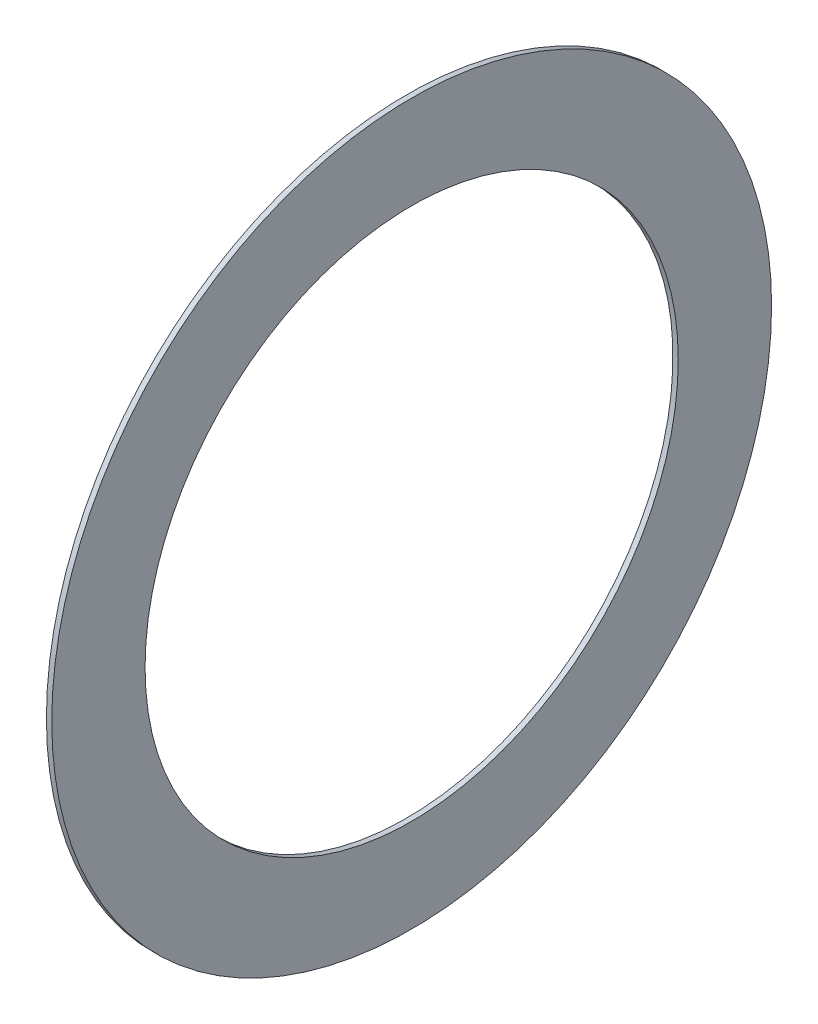
ISO-10303-21;
HEADER;
FILE_DESCRIPTION(('STEP AP214'),'2;1');
FILE_NAME('part.step','',(''),(''),'','','');
FILE_SCHEMA(('AUTOMOTIVE_DESIGN { 1 0 10303 214 1 1 1 1 }'));
ENDSEC;
DATA;
#1=APPLICATION_CONTEXT('core data for automotive mechanical design processes');
#2=APPLICATION_PROTOCOL_DEFINITION('international standard','automotive_design',2000,#1);
#3=PRODUCT_CONTEXT('',#1,'mechanical');
#4=PRODUCT('Part','Part','',(#3));
#5=PRODUCT_RELATED_PRODUCT_CATEGORY('part','',(#4));
#6=PRODUCT_DEFINITION_FORMATION('','',#4);
#7=PRODUCT_DEFINITION_CONTEXT('part definition',#1,'design');
#8=PRODUCT_DEFINITION('design','',#6,#7);
#9=PRODUCT_DEFINITION_SHAPE('','',#8);
#10=(LENGTH_UNIT() NAMED_UNIT(*) SI_UNIT(.MILLI.,.METRE.));
#11=(NAMED_UNIT(*) PLANE_ANGLE_UNIT() SI_UNIT($,.RADIAN.));
#12=(NAMED_UNIT(*) SI_UNIT($,.STERADIAN.) SOLID_ANGLE_UNIT());
#13=UNCERTAINTY_MEASURE_WITH_UNIT(LENGTH_MEASURE(1.E-05),#10,'distance_accuracy_value','');
#14=(GEOMETRIC_REPRESENTATION_CONTEXT(3) GLOBAL_UNCERTAINTY_ASSIGNED_CONTEXT((#13)) GLOBAL_UNIT_ASSIGNED_CONTEXT((#10,
#11,#12)) REPRESENTATION_CONTEXT('',''));
#15=CARTESIAN_POINT('',(0.,0.,0.));
#16=DIRECTION('',(0.,0.,1.));
#17=DIRECTION('',(1.,0.,0.));
#18=AXIS2_PLACEMENT_3D('',#15,#16,#17);
#19=CARTESIAN_POINT('',(2.,-68.2479296915759,-67.5));
#20=DIRECTION('',(-1.,0.,0.));
#21=DIRECTION('',(0.,0.,1.));
#22=AXIS2_PLACEMENT_3D('',#19,#20,#21);
#23=PLANE('',#22);
#24=CARTESIAN_POINT('',(2.,0.,0.));
#25=DIRECTION('',(-1.,0.,0.));
#26=DIRECTION('',(0.,0.,-1.));
#27=AXIS2_PLACEMENT_3D('',#24,#25,#26);
#28=CIRCLE('',#27,67.5);
#29=CARTESIAN_POINT('',(2.,0.,-67.5));
#30=VERTEX_POINT('',#29);
#31=EDGE_CURVE('E30',#30,#30,#28,.F.);
#32=ORIENTED_EDGE('',*,*,#31,.F.);
#33=EDGE_LOOP('',(#32));
#34=FACE_BOUND('',#33,.T.);
#35=CARTESIAN_POINT('',(2.,0.,0.));
#36=DIRECTION('',(1.,0.,0.));
#37=DIRECTION('',(0.,-1.16851737175239E-09,1.));
#38=AXIS2_PLACEMENT_3D('',#35,#36,#37);
#39=CIRCLE('',#38,50.);
#40=CARTESIAN_POINT('',(2.,-5.84258685876193E-08,50.));
#41=VERTEX_POINT('',#40);
#42=EDGE_CURVE('E26',#41,#41,#39,.T.);
#43=ORIENTED_EDGE('',*,*,#42,.T.);
#44=EDGE_LOOP('',(#43));
#45=FACE_BOUND('',#44,.T.);
#46=ADVANCED_FACE('F15',(#34,#45),#23,.T.);
#47=CARTESIAN_POINT('',(3.,-68.2479295829236,67.5));
#48=DIRECTION('',(1.,0.,0.));
#49=DIRECTION('',(0.,0.,-1.));
#50=AXIS2_PLACEMENT_3D('',#47,#48,#49);
#51=PLANE('',#50);
#52=CARTESIAN_POINT('',(3.,0.,0.));
#53=DIRECTION('',(1.,0.,0.));
#54=DIRECTION('',(0.,-1.16865121695069E-09,1.));
#55=AXIS2_PLACEMENT_3D('',#52,#53,#54);
#56=CIRCLE('',#55,67.5);
#57=CARTESIAN_POINT('',(3.,-7.88839571441713E-08,67.5));
#58=VERTEX_POINT('',#57);
#59=EDGE_CURVE('E22',#58,#58,#56,.T.);
#60=ORIENTED_EDGE('',*,*,#59,.T.);
#61=EDGE_LOOP('',(#60));
#62=FACE_BOUND('',#61,.T.);
#63=CARTESIAN_POINT('',(3.,0.,0.));
#64=DIRECTION('',(-1.,0.,0.));
#65=DIRECTION('',(0.,0.,-1.));
#66=AXIS2_PLACEMENT_3D('',#63,#64,#65);
#67=CIRCLE('',#66,50.);
#68=CARTESIAN_POINT('',(3.,0.,-50.));
#69=VERTEX_POINT('',#68);
#70=EDGE_CURVE('E10',#69,#69,#67,.F.);
#71=ORIENTED_EDGE('',*,*,#70,.F.);
#72=EDGE_LOOP('',(#71));
#73=FACE_BOUND('',#72,.T.);
#74=ADVANCED_FACE('F40',(#62,#73),#51,.T.);
#75=CARTESIAN_POINT('',(50.,0.,0.));
#76=DIRECTION('',(1.,0.,0.));
#77=DIRECTION('',(0.,0.,1.));
#78=AXIS2_PLACEMENT_3D('',#75,#76,#77);
#79=CYLINDRICAL_SURFACE('',#78,50.);
#80=ORIENTED_EDGE('',*,*,#70,.T.);
#81=EDGE_LOOP('',(#80));
#82=FACE_BOUND('',#81,.T.);
#83=ORIENTED_EDGE('',*,*,#42,.F.);
#84=EDGE_LOOP('',(#83));
#85=FACE_BOUND('',#84,.T.);
#86=ADVANCED_FACE('F44',(#82,#85),#79,.F.);
#87=CARTESIAN_POINT('',(50.,0.,0.));
#88=DIRECTION('',(1.,0.,0.));
#89=DIRECTION('',(0.,0.,1.));
#90=AXIS2_PLACEMENT_3D('',#87,#88,#89);
#91=CYLINDRICAL_SURFACE('',#90,67.5);
#92=ORIENTED_EDGE('',*,*,#31,.T.);
#93=EDGE_LOOP('',(#92));
#94=FACE_BOUND('',#93,.T.);
#95=ORIENTED_EDGE('',*,*,#59,.F.);
#96=EDGE_LOOP('',(#95));
#97=FACE_BOUND('',#96,.T.);
#98=ADVANCED_FACE('F17',(#94,#97),#91,.T.);
#99=CLOSED_SHELL('',(#46,#74,#86,#98));
#100=MANIFOLD_SOLID_BREP('B1',#99);
#101=ADVANCED_BREP_SHAPE_REPRESENTATION('',(#18,#100),#14);
#102=SHAPE_DEFINITION_REPRESENTATION(#9,#101);
ENDSEC;
END-ISO-10303-21;
